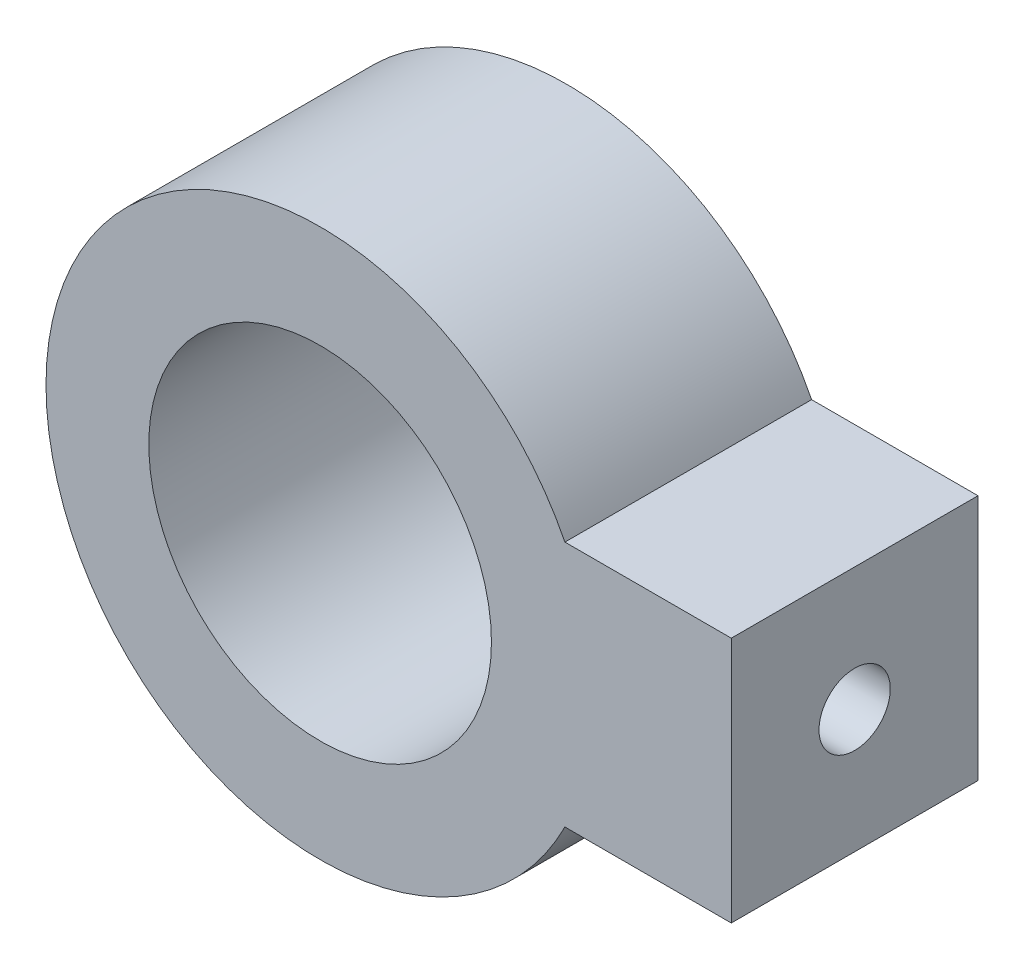
ISO-10303-21;
HEADER;
FILE_DESCRIPTION(('STEP AP214'),'2;1');
FILE_NAME('part.step','',(''),(''),'','','');
FILE_SCHEMA(('AUTOMOTIVE_DESIGN { 1 0 10303 214 1 1 1 1 }'));
ENDSEC;
DATA;
#1=APPLICATION_CONTEXT('core data for automotive mechanical design processes');
#2=APPLICATION_PROTOCOL_DEFINITION('international standard','automotive_design',2000,#1);
#3=PRODUCT_CONTEXT('',#1,'mechanical');
#4=PRODUCT('Part','Part','',(#3));
#5=PRODUCT_RELATED_PRODUCT_CATEGORY('part','',(#4));
#6=PRODUCT_DEFINITION_FORMATION('','',#4);
#7=PRODUCT_DEFINITION_CONTEXT('part definition',#1,'design');
#8=PRODUCT_DEFINITION('design','',#6,#7);
#9=PRODUCT_DEFINITION_SHAPE('','',#8);
#10=(LENGTH_UNIT() NAMED_UNIT(*) SI_UNIT(.MILLI.,.METRE.));
#11=(NAMED_UNIT(*) PLANE_ANGLE_UNIT() SI_UNIT($,.RADIAN.));
#12=(NAMED_UNIT(*) SI_UNIT($,.STERADIAN.) SOLID_ANGLE_UNIT());
#13=UNCERTAINTY_MEASURE_WITH_UNIT(LENGTH_MEASURE(1.E-05),#10,'distance_accuracy_value','');
#14=(GEOMETRIC_REPRESENTATION_CONTEXT(3) GLOBAL_UNCERTAINTY_ASSIGNED_CONTEXT((#13)) GLOBAL_UNIT_ASSIGNED_CONTEXT((#10,
#11,#12)) REPRESENTATION_CONTEXT('',''));
#15=CARTESIAN_POINT('',(0.,0.,0.));
#16=DIRECTION('',(0.,0.,1.));
#17=DIRECTION('',(1.,0.,0.));
#18=AXIS2_PLACEMENT_3D('',#15,#16,#17);
#19=CARTESIAN_POINT('',(0.,0.,9.));
#20=DIRECTION('',(0.,0.,-1.));
#21=DIRECTION('',(-1.,0.,0.));
#22=AXIS2_PLACEMENT_3D('',#19,#20,#21);
#23=CYLINDRICAL_SURFACE('',#22,10.);
#24=DIRECTION('',(0.,0.,-1.));
#25=VECTOR('',#24,1.);
#26=CARTESIAN_POINT('',(8.93028554974588,-4.5,9.));
#27=LINE('',#26,#25);
#28=CARTESIAN_POINT('',(8.93028554974588,-4.5,9.));
#29=VERTEX_POINT('',#28);
#30=CARTESIAN_POINT('',(8.93028554974588,-4.5,0.));
#31=VERTEX_POINT('',#30);
#32=EDGE_CURVE('E11',#29,#31,#27,.T.);
#33=ORIENTED_EDGE('',*,*,#32,.F.);
#34=CARTESIAN_POINT('',(0.,0.,9.));
#35=DIRECTION('',(0.,0.,1.));
#36=DIRECTION('',(1.,0.,0.));
#37=AXIS2_PLACEMENT_3D('',#34,#35,#36);
#38=CIRCLE('',#37,10.);
#39=CARTESIAN_POINT('',(8.93028554974588,4.5,9.));
#40=VERTEX_POINT('',#39);
#41=EDGE_CURVE('E86',#40,#29,#38,.T.);
#42=ORIENTED_EDGE('',*,*,#41,.F.);
#43=DIRECTION('',(0.,0.,-1.));
#44=VECTOR('',#43,1.);
#45=CARTESIAN_POINT('',(8.93028554974588,4.5,9.));
#46=LINE('',#45,#44);
#47=CARTESIAN_POINT('',(8.93028554974588,4.5,0.));
#48=VERTEX_POINT('',#47);
#49=EDGE_CURVE('E51',#48,#40,#46,.F.);
#50=ORIENTED_EDGE('',*,*,#49,.F.);
#51=CARTESIAN_POINT('',(0.,0.,0.));
#52=DIRECTION('',(0.,0.,1.));
#53=DIRECTION('',(1.,0.,0.));
#54=AXIS2_PLACEMENT_3D('',#51,#52,#53);
#55=CIRCLE('',#54,10.);
#56=EDGE_CURVE('E59',#48,#31,#55,.T.);
#57=ORIENTED_EDGE('',*,*,#56,.T.);
#58=EDGE_LOOP('',(#33,#42,#50,#57));
#59=FACE_BOUND('',#58,.T.);
#60=ADVANCED_FACE('F43',(#59),#23,.T.);
#61=CARTESIAN_POINT('',(0.,0.,9.));
#62=DIRECTION('',(0.,0.,1.));
#63=DIRECTION('',(1.,0.,0.));
#64=AXIS2_PLACEMENT_3D('',#61,#62,#63);
#65=PLANE('',#64);
#66=ORIENTED_EDGE('',*,*,#41,.T.);
#67=DIRECTION('',(1.,0.,0.));
#68=VECTOR('',#67,1.);
#69=CARTESIAN_POINT('',(8.,-4.5,9.));
#70=LINE('',#69,#68);
#71=CARTESIAN_POINT('',(15.,-4.5,9.));
#72=VERTEX_POINT('',#71);
#73=EDGE_CURVE('E78',#29,#72,#70,.T.);
#74=ORIENTED_EDGE('',*,*,#73,.T.);
#75=DIRECTION('',(0.,1.,0.));
#76=VECTOR('',#75,1.);
#77=CARTESIAN_POINT('',(15.,-4.5,9.));
#78=LINE('',#77,#76);
#79=CARTESIAN_POINT('',(15.,4.5,9.));
#80=VERTEX_POINT('',#79);
#81=EDGE_CURVE('E88',#72,#80,#78,.T.);
#82=ORIENTED_EDGE('',*,*,#81,.T.);
#83=DIRECTION('',(-1.,0.,0.));
#84=VECTOR('',#83,1.);
#85=CARTESIAN_POINT('',(15.,4.5,9.));
#86=LINE('',#85,#84);
#87=EDGE_CURVE('E104',#80,#40,#86,.T.);
#88=ORIENTED_EDGE('',*,*,#87,.T.);
#89=EDGE_LOOP('',(#66,#74,#82,#88));
#90=FACE_BOUND('',#89,.T.);
#91=CARTESIAN_POINT('',(0.,0.,9.));
#92=DIRECTION('',(0.,0.,1.));
#93=DIRECTION('',(1.,0.,0.));
#94=AXIS2_PLACEMENT_3D('',#91,#92,#93);
#95=CIRCLE('',#94,6.25);
#96=CARTESIAN_POINT('',(6.25,0.,9.));
#97=VERTEX_POINT('',#96);
#98=EDGE_CURVE('E120',#97,#97,#95,.T.);
#99=ORIENTED_EDGE('',*,*,#98,.F.);
#100=EDGE_LOOP('',(#99));
#101=FACE_BOUND('',#100,.T.);
#102=ADVANCED_FACE('F85',(#90,#101),#65,.T.);
#103=CARTESIAN_POINT('',(0.,0.,0.));
#104=DIRECTION('',(0.,0.,1.));
#105=DIRECTION('',(1.,0.,0.));
#106=AXIS2_PLACEMENT_3D('',#103,#104,#105);
#107=PLANE('',#106);
#108=ORIENTED_EDGE('',*,*,#56,.F.);
#109=DIRECTION('',(-1.,0.,0.));
#110=VECTOR('',#109,1.);
#111=CARTESIAN_POINT('',(15.,4.5,0.));
#112=LINE('',#111,#110);
#113=CARTESIAN_POINT('',(15.,4.5,0.));
#114=VERTEX_POINT('',#113);
#115=EDGE_CURVE('E89',#114,#48,#112,.T.);
#116=ORIENTED_EDGE('',*,*,#115,.F.);
#117=DIRECTION('',(0.,1.,0.));
#118=VECTOR('',#117,1.);
#119=CARTESIAN_POINT('',(15.,-4.5,0.));
#120=LINE('',#119,#118);
#121=CARTESIAN_POINT('',(15.,-4.5,0.));
#122=VERTEX_POINT('',#121);
#123=EDGE_CURVE('E112',#122,#114,#120,.T.);
#124=ORIENTED_EDGE('',*,*,#123,.F.);
#125=DIRECTION('',(1.,0.,0.));
#126=VECTOR('',#125,1.);
#127=CARTESIAN_POINT('',(8.,-4.5,0.));
#128=LINE('',#127,#126);
#129=EDGE_CURVE('E96',#31,#122,#128,.T.);
#130=ORIENTED_EDGE('',*,*,#129,.F.);
#131=EDGE_LOOP('',(#108,#116,#124,#130));
#132=FACE_BOUND('',#131,.T.);
#133=CARTESIAN_POINT('',(0.,0.,0.));
#134=DIRECTION('',(0.,0.,1.));
#135=DIRECTION('',(1.,0.,0.));
#136=AXIS2_PLACEMENT_3D('',#133,#134,#135);
#137=CIRCLE('',#136,6.25);
#138=CARTESIAN_POINT('',(6.25,0.,0.));
#139=VERTEX_POINT('',#138);
#140=EDGE_CURVE('E97',#139,#139,#137,.T.);
#141=ORIENTED_EDGE('',*,*,#140,.T.);
#142=EDGE_LOOP('',(#141));
#143=FACE_BOUND('',#142,.T.);
#144=ADVANCED_FACE('F126',(#132,#143),#107,.F.);
#145=CARTESIAN_POINT('',(0.,0.,9.));
#146=DIRECTION('',(0.,0.,-1.));
#147=DIRECTION('',(-1.,0.,0.));
#148=AXIS2_PLACEMENT_3D('',#145,#146,#147);
#149=CYLINDRICAL_SURFACE('',#148,6.25);
#150=CARTESIAN_POINT('',(6.25,0.,3.2));
#151=CARTESIAN_POINT('',(6.24999866390579,-0.0721880338353737,3.20000257998929));
#152=CARTESIAN_POINT('',(6.248736549544,-0.144408070056718,3.20603313229287));
#153=CARTESIAN_POINT('',(6.24382353153826,-0.286802595986333,3.22997440062029));
#154=CARTESIAN_POINT('',(6.24017080969524,-0.356975486251105,3.24789415923484));
#155=CARTESIAN_POINT('',(6.23088396610351,-0.493196719612507,3.29503294256043));
#156=CARTESIAN_POINT('',(6.22525181476898,-0.55924908775234,3.32424073352112));
#157=CARTESIAN_POINT('',(6.21261654104479,-0.685512240017918,3.39309213420546));
#158=CARTESIAN_POINT('',(6.20561348089579,-0.745723289159938,3.432735270182));
#159=CARTESIAN_POINT('',(6.19089141284008,-0.859476728423466,3.52194476058888));
#160=CARTESIAN_POINT('',(6.18316424208161,-0.912921647148355,3.57163406799522));
#161=CARTESIAN_POINT('',(6.16792345232901,-1.01078123233217,3.67926123771897));
#162=CARTESIAN_POINT('',(6.16040985101129,-1.05519515318748,3.73719978042644));
#163=CARTESIAN_POINT('',(6.14636690210938,-1.13415320164103,3.86039005124818));
#164=CARTESIAN_POINT('',(6.13984804009531,-1.16859521736711,3.92570852882241));
#165=CARTESIAN_POINT('',(6.12864912260314,-1.22597726554449,4.06136372231924));
#166=CARTESIAN_POINT('',(6.12396886970327,-1.24891853296871,4.13169989850457));
#167=CARTESIAN_POINT('',(6.1170599131927,-1.28232904723059,4.27434153599051));
#168=CARTESIAN_POINT('',(6.11479749857398,-1.29296996913949,4.3466051195539));
#169=CARTESIAN_POINT('',(6.1128790055134,-1.30201121205367,4.49192454411912));
#170=CARTESIAN_POINT('',(6.11322263827414,-1.30041288938945,4.56498029643829));
#171=CARTESIAN_POINT('',(6.11644682995733,-1.28515954443023,4.70854588241676));
#172=CARTESIAN_POINT('',(6.11928574783139,-1.27170241119848,4.77907781668416));
#173=CARTESIAN_POINT('',(6.12711495696342,-1.23342628546528,4.91686055216499));
#174=CARTESIAN_POINT('',(6.13210535849133,-1.20860671060089,4.9841111850053));
#175=CARTESIAN_POINT('',(6.14371717305132,-1.14812432035159,5.11398677264704));
#176=CARTESIAN_POINT('',(6.15035017035826,-1.11238404976516,5.17657457825089));
#177=CARTESIAN_POINT('',(6.16449250858457,-1.0311293731486,5.29493831877712));
#178=CARTESIAN_POINT('',(6.1720019580164,-0.985613756257519,5.35071340847229));
#179=CARTESIAN_POINT('',(6.18723075501508,-0.88504588131285,5.45500928566079));
#180=CARTESIAN_POINT('',(6.19495134031028,-0.829824983179855,5.50336742656974));
#181=CARTESIAN_POINT('',(6.20959872838224,-0.711971888840543,5.59016127049409));
#182=CARTESIAN_POINT('',(6.21652551932107,-0.649339582135521,5.62859682554375));
#183=CARTESIAN_POINT('',(6.22882407206185,-0.518253473087787,5.694488724131));
#184=CARTESIAN_POINT('',(6.23419303548394,-0.44978947687174,5.72192534321246));
#185=CARTESIAN_POINT('',(6.24274995924435,-0.309087001034976,5.76486103517154));
#186=CARTESIAN_POINT('',(6.24593820577048,-0.236849018035741,5.78036167450886));
#187=CARTESIAN_POINT('',(6.24973424384651,-0.092045752853614,5.79875251012869));
#188=CARTESIAN_POINT('',(6.25038754182249,-0.0195098755956263,5.8018651181103));
#189=CARTESIAN_POINT('',(6.24916694021021,0.125045418306469,5.79599212379042));
#190=CARTESIAN_POINT('',(6.24729319484641,0.197064866198393,5.78700725979292));
#191=CARTESIAN_POINT('',(6.24125761947136,0.337817325850834,5.7573790161019));
#192=CARTESIAN_POINT('',(6.23711840481734,0.406575637752777,5.73685081473706));
#193=CARTESIAN_POINT('',(6.22701462109886,0.539673755273385,5.68484530294035));
#194=CARTESIAN_POINT('',(6.22104990718076,0.604013209758815,5.653367123599));
#195=CARTESIAN_POINT('',(6.20784381614938,0.72737763559989,5.57988147312984));
#196=CARTESIAN_POINT('',(6.20058673581721,0.78632193008992,5.53774144828718));
#197=CARTESIAN_POINT('',(6.18563570569592,0.896382331521054,5.44430455729017));
#198=CARTESIAN_POINT('',(6.17794170503283,0.947497524287409,5.39300662331337));
#199=CARTESIAN_POINT('',(6.16282901000841,1.04131592743374,5.28169408184518));
#200=CARTESIAN_POINT('',(6.15541698138264,1.08386588060248,5.22154923741905));
#201=CARTESIAN_POINT('',(6.14185383160522,1.15826046642996,5.09483575338384));
#202=CARTESIAN_POINT('',(6.13570265803561,1.1901055441613,5.02826738099152));
#203=CARTESIAN_POINT('',(6.1254125745716,1.24198269871992,4.89094257796871));
#204=CARTESIAN_POINT('',(6.12126284064039,1.26207844574188,4.82021105033811));
#205=CARTESIAN_POINT('',(6.1154238958216,1.29007706095406,4.67627889933011));
#206=CARTESIAN_POINT('',(6.11373433424223,1.29798166697236,4.60307862938852));
#207=CARTESIAN_POINT('',(6.11302760991146,1.3013052353193,4.45782823240547));
#208=CARTESIAN_POINT('',(6.11395854259959,1.29696669537161,4.3857837987009));
#209=CARTESIAN_POINT('',(6.11827135350503,1.27646521212063,4.24347610701942));
#210=CARTESIAN_POINT('',(6.12165320835849,1.26030238153447,4.17321283206991));
#211=CARTESIAN_POINT('',(6.13046272190422,1.21672310499825,4.03663226236536));
#212=CARTESIAN_POINT('',(6.13588454900163,1.18933871800655,3.97030433764421));
#213=CARTESIAN_POINT('',(6.148165973683,1.12412249003985,3.84314720607768));
#214=CARTESIAN_POINT('',(6.15502570420727,1.08628968296101,3.78231850840411));
#215=CARTESIAN_POINT('',(6.16956726619989,1.00043227917348,3.66668401848896));
#216=CARTESIAN_POINT('',(6.17726186677732,0.952233504416384,3.61200913319007));
#217=CARTESIAN_POINT('',(6.19251702595659,0.847369269056518,3.51144354315477));
#218=CARTESIAN_POINT('',(6.20007755329545,0.790701862052601,3.46555486335502));
#219=CARTESIAN_POINT('',(6.21431539131551,0.669725545314443,3.38336343222144));
#220=CARTESIAN_POINT('',(6.22098155761226,0.605336327445583,3.34717686213995));
#221=CARTESIAN_POINT('',(6.23256909161379,0.471267712779139,3.28619605401506));
#222=CARTESIAN_POINT('',(6.2374919858819,0.401593009675098,3.26139184290975));
#223=CARTESIAN_POINT('',(6.24411422201492,0.276497329212865,3.22852501835495));
#224=CARTESIAN_POINT('',(6.24630816087785,0.221774370149253,3.21784775723363));
#225=CARTESIAN_POINT('',(6.24925153876851,0.111373934148549,3.20358438301109));
#226=CARTESIAN_POINT('',(6.25000103086006,0.0556964923515553,3.19999800941588));
#227=CARTESIAN_POINT('',(6.25,0.,3.2));
#228=B_SPLINE_CURVE_WITH_KNOTS('',3,(#150,#151,#152,#153,#154,#155,#156,#157,#158,#159,#160,
#161,#162,#163,#164,#165,#166,#167,#168,#169,#170,#171,#172,#173,#174,#175,#176,#177,#178,#179,
#180,#181,#182,#183,#184,#185,#186,#187,#188,#189,#190,#191,#192,#193,#194,#195,#196,#197,#198,
#199,#200,#201,#202,#203,#204,#205,#206,#207,#208,#209,#210,#211,#212,#213,#214,#215,#216,#217,
#218,#219,#220,#221,#222,#223,#224,#225,#226,#227),.UNSPECIFIED.,.T.,.F.,(4,2,2,2,2,2,2,2,2,2,2,
2,2,2,2,2,2,2,2,2,2,2,2,2,2,2,2,2,2,2,2,2,2,2,2,2,2,2,4),(0.,0.216360298983076,
0.432885344360353,0.649195458509515,0.865495754236466,1.08462378961128,1.30376990896522,
1.52508655164527,1.7463794238166,1.96454494477804,2.18268628938905,2.39725499244209,
2.61183469408659,2.82797309295078,3.04413828008845,3.26451821185542,3.48490142974079,
3.70567811293751,3.92642581679978,4.14319189409037,4.35994474283179,4.5745722786974,
4.78921684970763,5.00667375037251,5.22415602333582,5.44523845280196,5.66631168926937,
5.88617554110983,6.10600804880457,6.32151711059196,6.53702411802805,6.75191968718103,
6.96683513311758,7.18569178421749,7.40459881415436,7.62602068892804,7.84724818480798,
8.01418655138472,8.18111878512546),.UNSPECIFIED.);
#229=CARTESIAN_POINT('',(6.25,0.,3.2));
#230=VERTEX_POINT('',#229);
#231=EDGE_CURVE('E115',#230,#230,#228,.T.);
#232=ORIENTED_EDGE('',*,*,#231,.F.);
#233=EDGE_LOOP('',(#232));
#234=FACE_BOUND('',#233,.T.);
#235=ORIENTED_EDGE('',*,*,#98,.T.);
#236=EDGE_LOOP('',(#235));
#237=FACE_BOUND('',#236,.T.);
#238=ORIENTED_EDGE('',*,*,#140,.F.);
#239=EDGE_LOOP('',(#238));
#240=FACE_BOUND('',#239,.T.);
#241=ADVANCED_FACE('F132',(#234,#237,#240),#149,.F.);
#242=CARTESIAN_POINT('',(8.,-4.5,9.));
#243=DIRECTION('',(0.,1.,0.));
#244=DIRECTION('',(0.,0.,1.));
#245=AXIS2_PLACEMENT_3D('',#242,#243,#244);
#246=PLANE('',#245);
#247=ORIENTED_EDGE('',*,*,#73,.F.);
#248=ORIENTED_EDGE('',*,*,#32,.T.);
#249=ORIENTED_EDGE('',*,*,#129,.T.);
#250=DIRECTION('',(0.,0.,-1.));
#251=VECTOR('',#250,1.);
#252=CARTESIAN_POINT('',(15.,-4.5,9.));
#253=LINE('',#252,#251);
#254=EDGE_CURVE('E91',#72,#122,#253,.T.);
#255=ORIENTED_EDGE('',*,*,#254,.F.);
#256=EDGE_LOOP('',(#247,#248,#249,#255));
#257=FACE_BOUND('',#256,.T.);
#258=ADVANCED_FACE('F94',(#257),#246,.F.);
#259=CARTESIAN_POINT('',(15.,4.5,9.));
#260=DIRECTION('',(0.,-1.,0.));
#261=DIRECTION('',(0.,0.,-1.));
#262=AXIS2_PLACEMENT_3D('',#259,#260,#261);
#263=PLANE('',#262);
#264=ORIENTED_EDGE('',*,*,#115,.T.);
#265=ORIENTED_EDGE('',*,*,#49,.T.);
#266=ORIENTED_EDGE('',*,*,#87,.F.);
#267=DIRECTION('',(0.,0.,-1.));
#268=VECTOR('',#267,1.);
#269=CARTESIAN_POINT('',(15.,4.5,9.));
#270=LINE('',#269,#268);
#271=EDGE_CURVE('E99',#80,#114,#270,.T.);
#272=ORIENTED_EDGE('',*,*,#271,.T.);
#273=EDGE_LOOP('',(#264,#265,#266,#272));
#274=FACE_BOUND('',#273,.T.);
#275=ADVANCED_FACE('F123',(#274),#263,.F.);
#276=CARTESIAN_POINT('',(15.,-4.5,9.));
#277=DIRECTION('',(-1.,0.,0.));
#278=DIRECTION('',(0.,0.,1.));
#279=AXIS2_PLACEMENT_3D('',#276,#277,#278);
#280=PLANE('',#279);
#281=CARTESIAN_POINT('',(15.,0.,4.5));
#282=DIRECTION('',(-1.,0.,0.));
#283=DIRECTION('',(0.,0.,1.));
#284=AXIS2_PLACEMENT_3D('',#281,#282,#283);
#285=CIRCLE('',#284,1.3);
#286=CARTESIAN_POINT('',(15.,0.,5.8));
#287=VERTEX_POINT('',#286);
#288=EDGE_CURVE('E46',#287,#287,#285,.T.);
#289=ORIENTED_EDGE('',*,*,#288,.T.);
#290=EDGE_LOOP('',(#289));
#291=FACE_BOUND('',#290,.T.);
#292=ORIENTED_EDGE('',*,*,#123,.T.);
#293=ORIENTED_EDGE('',*,*,#271,.F.);
#294=ORIENTED_EDGE('',*,*,#81,.F.);
#295=ORIENTED_EDGE('',*,*,#254,.T.);
#296=EDGE_LOOP('',(#292,#293,#294,#295));
#297=FACE_BOUND('',#296,.T.);
#298=ADVANCED_FACE('F105',(#291,#297),#280,.F.);
#299=CARTESIAN_POINT('',(5.,0.,4.5));
#300=DIRECTION('',(1.,0.,0.));
#301=DIRECTION('',(0.,0.,-1.));
#302=AXIS2_PLACEMENT_3D('',#299,#300,#301);
#303=CYLINDRICAL_SURFACE('',#302,1.3);
#304=ORIENTED_EDGE('',*,*,#231,.T.);
#305=EDGE_LOOP('',(#304));
#306=FACE_BOUND('',#305,.T.);
#307=ORIENTED_EDGE('',*,*,#288,.F.);
#308=EDGE_LOOP('',(#307));
#309=FACE_BOUND('',#308,.T.);
#310=ADVANCED_FACE('F176',(#306,#309),#303,.F.);
#311=CLOSED_SHELL('',(#60,#102,#144,#241,#258,#275,#298,#310));
#312=MANIFOLD_SOLID_BREP('B2',#311);
#313=ADVANCED_BREP_SHAPE_REPRESENTATION('',(#18,#312),#14);
#314=SHAPE_DEFINITION_REPRESENTATION(#9,#313);
ENDSEC;
END-ISO-10303-21;
